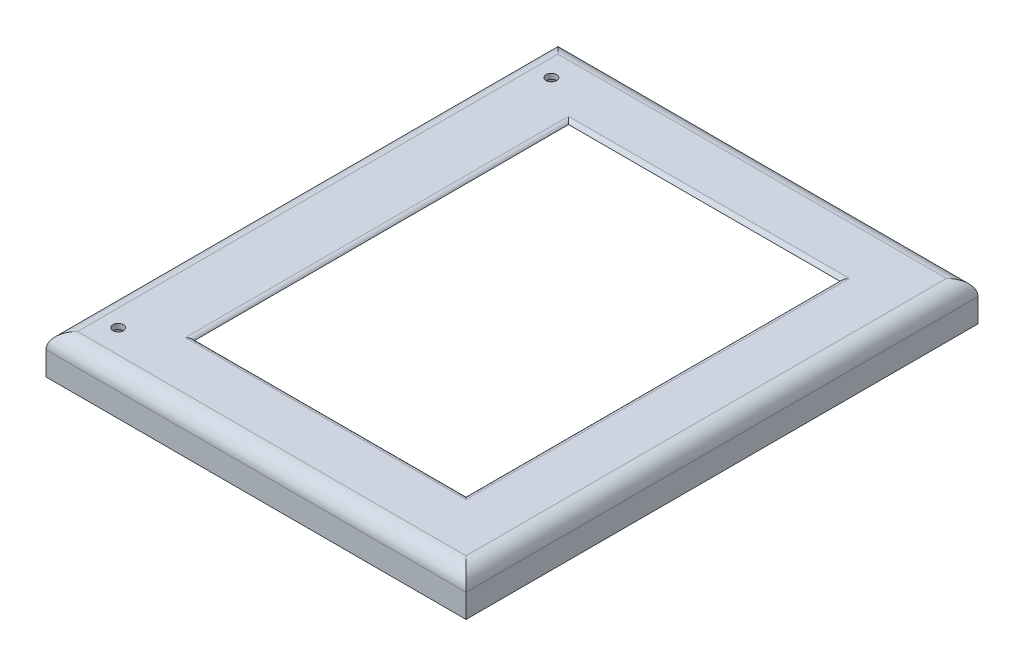
ISO-10303-21;
HEADER;
FILE_DESCRIPTION(('STEP AP214'),'2;1');
FILE_NAME('part.step','',(''),(''),'','','');
FILE_SCHEMA(('AUTOMOTIVE_DESIGN { 1 0 10303 214 1 1 1 1 }'));
ENDSEC;
DATA;
#1=APPLICATION_CONTEXT('core data for automotive mechanical design processes');
#2=APPLICATION_PROTOCOL_DEFINITION('international standard','automotive_design',2000,#1);
#3=PRODUCT_CONTEXT('',#1,'mechanical');
#4=PRODUCT('Part','Part','',(#3));
#5=PRODUCT_RELATED_PRODUCT_CATEGORY('part','',(#4));
#6=PRODUCT_DEFINITION_FORMATION('','',#4);
#7=PRODUCT_DEFINITION_CONTEXT('part definition',#1,'design');
#8=PRODUCT_DEFINITION('design','',#6,#7);
#9=PRODUCT_DEFINITION_SHAPE('','',#8);
#10=(LENGTH_UNIT() NAMED_UNIT(*) SI_UNIT(.MILLI.,.METRE.));
#11=(NAMED_UNIT(*) PLANE_ANGLE_UNIT() SI_UNIT($,.RADIAN.));
#12=(NAMED_UNIT(*) SI_UNIT($,.STERADIAN.) SOLID_ANGLE_UNIT());
#13=UNCERTAINTY_MEASURE_WITH_UNIT(LENGTH_MEASURE(1.E-05),#10,'distance_accuracy_value','');
#14=(GEOMETRIC_REPRESENTATION_CONTEXT(3) GLOBAL_UNCERTAINTY_ASSIGNED_CONTEXT((#13)) GLOBAL_UNIT_ASSIGNED_CONTEXT((#10,
#11,#12)) REPRESENTATION_CONTEXT('',''));
#15=CARTESIAN_POINT('',(0.,0.,0.));
#16=DIRECTION('',(0.,0.,1.));
#17=DIRECTION('',(1.,0.,0.));
#18=AXIS2_PLACEMENT_3D('',#15,#16,#17);
#19=CARTESIAN_POINT('',(70.485,16.51,-90.17));
#20=DIRECTION('',(0.,0.,1.));
#21=DIRECTION('',(1.,0.,0.));
#22=AXIS2_PLACEMENT_3D('',#19,#20,#21);
#23=CYLINDRICAL_SURFACE('',#22,2.54);
#24=CARTESIAN_POINT('',(70.485,16.51,-92.71));
#25=DIRECTION('',(0.707106781186547,0.,0.707106781186547));
#26=DIRECTION('',(-0.707106781186547,0.,0.707106781186548));
#27=AXIS2_PLACEMENT_3D('',#24,#25,#26);
#28=ELLIPSE('',#27,3.59210244842766,2.54);
#29=CARTESIAN_POINT('',(68.2852954743876,17.78,-90.5102954743875));
#30=VERTEX_POINT('',#29);
#31=CARTESIAN_POINT('',(70.485,19.05,-92.71));
#32=VERTEX_POINT('',#31);
#33=EDGE_CURVE('E297',#30,#32,#28,.F.);
#34=ORIENTED_EDGE('',*,*,#33,.F.);
#35=DIRECTION('',(0.,0.,1.));
#36=VECTOR('',#35,1.);
#37=CARTESIAN_POINT('',(68.2852954743876,17.78,-90.17));
#38=LINE('',#37,#36);
#39=CARTESIAN_POINT('',(68.2852954743876,17.78,90.5102954743875));
#40=VERTEX_POINT('',#39);
#41=EDGE_CURVE('E233',#30,#40,#38,.T.);
#42=ORIENTED_EDGE('',*,*,#41,.T.);
#43=CARTESIAN_POINT('',(70.485,16.51,92.71));
#44=DIRECTION('',(-0.707106781186547,0.,0.707106781186548));
#45=DIRECTION('',(-0.707106781186547,0.,-0.707106781186547));
#46=AXIS2_PLACEMENT_3D('',#43,#44,#45);
#47=ELLIPSE('',#46,3.59210244842766,2.54);
#48=CARTESIAN_POINT('',(70.485,19.05,92.71));
#49=VERTEX_POINT('',#48);
#50=EDGE_CURVE('E386',#49,#40,#47,.T.);
#51=ORIENTED_EDGE('',*,*,#50,.F.);
#52=DIRECTION('',(0.,0.,-1.));
#53=VECTOR('',#52,1.);
#54=CARTESIAN_POINT('',(70.485,19.05,90.17));
#55=LINE('',#54,#53);
#56=EDGE_CURVE('E373',#32,#49,#55,.F.);
#57=ORIENTED_EDGE('',*,*,#56,.F.);
#58=EDGE_LOOP('',(#34,#42,#51,#57));
#59=FACE_BOUND('',#58,.T.);
#60=ADVANCED_FACE('F38',(#59),#23,.T.);
#61=CARTESIAN_POINT('',(-62.8,16.51,-92.71));
#62=DIRECTION('',(1.,0.,0.));
#63=DIRECTION('',(0.,0.,-1.));
#64=AXIS2_PLACEMENT_3D('',#61,#62,#63);
#65=CYLINDRICAL_SURFACE('',#64,2.54);
#66=CARTESIAN_POINT('',(-65.34,16.51,-92.71));
#67=DIRECTION('',(0.707106781186547,0.,-0.707106781186548));
#68=DIRECTION('',(-0.707106781186548,0.,-0.707106781186547));
#69=AXIS2_PLACEMENT_3D('',#66,#67,#68);
#70=ELLIPSE('',#69,3.59210244842766,2.54);
#71=CARTESIAN_POINT('',(-63.1402954743875,17.78,-90.5102954743875));
#72=VERTEX_POINT('',#71);
#73=CARTESIAN_POINT('',(-65.34,19.05,-92.71));
#74=VERTEX_POINT('',#73);
#75=EDGE_CURVE('E384',#72,#74,#70,.F.);
#76=ORIENTED_EDGE('',*,*,#75,.F.);
#77=DIRECTION('',(1.,0.,0.));
#78=VECTOR('',#77,1.);
#79=CARTESIAN_POINT('',(-62.8,17.78,-90.5102954743875));
#80=LINE('',#79,#78);
#81=EDGE_CURVE('E61',#72,#30,#80,.T.);
#82=ORIENTED_EDGE('',*,*,#81,.T.);
#83=ORIENTED_EDGE('',*,*,#33,.T.);
#84=DIRECTION('',(-1.,0.,0.));
#85=VECTOR('',#84,1.);
#86=CARTESIAN_POINT('',(67.945,19.05,-92.71));
#87=LINE('',#86,#85);
#88=EDGE_CURVE('E360',#74,#32,#87,.F.);
#89=ORIENTED_EDGE('',*,*,#88,.F.);
#90=EDGE_LOOP('',(#76,#82,#83,#89));
#91=FACE_BOUND('',#90,.T.);
#92=ADVANCED_FACE('F392',(#91),#65,.T.);
#93=CARTESIAN_POINT('',(-62.8,16.51,92.71));
#94=DIRECTION('',(-1.,0.,0.));
#95=DIRECTION('',(0.,0.,1.));
#96=AXIS2_PLACEMENT_3D('',#93,#94,#95);
#97=CYLINDRICAL_SURFACE('',#96,2.54);
#98=ORIENTED_EDGE('',*,*,#50,.T.);
#99=DIRECTION('',(-1.,0.,0.));
#100=VECTOR('',#99,1.);
#101=CARTESIAN_POINT('',(-62.8,17.78,90.5102954743875));
#102=LINE('',#101,#100);
#103=CARTESIAN_POINT('',(-63.1402954743875,17.78,90.5102954743875));
#104=VERTEX_POINT('',#103);
#105=EDGE_CURVE('E223',#40,#104,#102,.T.);
#106=ORIENTED_EDGE('',*,*,#105,.T.);
#107=CARTESIAN_POINT('',(-65.34,16.51,92.71));
#108=DIRECTION('',(-0.707106781186548,0.,-0.707106781186547));
#109=DIRECTION('',(0.707106781186547,0.,-0.707106781186548));
#110=AXIS2_PLACEMENT_3D('',#107,#108,#109);
#111=ELLIPSE('',#110,3.59210244842766,2.54);
#112=CARTESIAN_POINT('',(-65.34,19.05,92.71));
#113=VERTEX_POINT('',#112);
#114=EDGE_CURVE('E248',#113,#104,#111,.T.);
#115=ORIENTED_EDGE('',*,*,#114,.F.);
#116=DIRECTION('',(1.,0.,0.));
#117=VECTOR('',#116,1.);
#118=CARTESIAN_POINT('',(-62.8,19.05,92.71));
#119=LINE('',#118,#117);
#120=EDGE_CURVE('E375',#49,#113,#119,.F.);
#121=ORIENTED_EDGE('',*,*,#120,.F.);
#122=EDGE_LOOP('',(#98,#106,#115,#121));
#123=FACE_BOUND('',#122,.T.);
#124=ADVANCED_FACE('F403',(#123),#97,.T.);
#125=CARTESIAN_POINT('',(-65.34,16.51,-90.17));
#126=DIRECTION('',(0.,0.,-1.));
#127=DIRECTION('',(-1.,0.,0.));
#128=AXIS2_PLACEMENT_3D('',#125,#126,#127);
#129=CYLINDRICAL_SURFACE('',#128,2.54);
#130=ORIENTED_EDGE('',*,*,#114,.T.);
#131=DIRECTION('',(0.,0.,-1.));
#132=VECTOR('',#131,1.);
#133=CARTESIAN_POINT('',(-63.1402954743875,17.78,-90.17));
#134=LINE('',#133,#132);
#135=EDGE_CURVE('E11',#104,#72,#134,.T.);
#136=ORIENTED_EDGE('',*,*,#135,.T.);
#137=ORIENTED_EDGE('',*,*,#75,.T.);
#138=DIRECTION('',(0.,0.,1.));
#139=VECTOR('',#138,1.);
#140=CARTESIAN_POINT('',(-65.34,19.05,-90.17));
#141=LINE('',#140,#139);
#142=EDGE_CURVE('E46',#113,#74,#141,.F.);
#143=ORIENTED_EDGE('',*,*,#142,.F.);
#144=EDGE_LOOP('',(#130,#136,#137,#143));
#145=FACE_BOUND('',#144,.T.);
#146=ADVANCED_FACE('F405',(#145),#129,.T.);
#147=CARTESIAN_POINT('',(101.6,19.05,-123.825));
#148=DIRECTION('',(-1.,0.,0.));
#149=DIRECTION('',(0.,0.,1.));
#150=AXIS2_PLACEMENT_3D('',#147,#148,#149);
#151=PLANE('',#150);
#152=DIRECTION('',(0.,-1.,0.));
#153=VECTOR('',#152,1.);
#154=CARTESIAN_POINT('',(101.6,19.05,-123.825));
#155=LINE('',#154,#153);
#156=CARTESIAN_POINT('',(101.6,11.43,-123.825));
#157=VERTEX_POINT('',#156);
#158=CARTESIAN_POINT('',(101.6,0.,-123.825));
#159=VERTEX_POINT('',#158);
#160=EDGE_CURVE('E334',#157,#159,#155,.T.);
#161=ORIENTED_EDGE('',*,*,#160,.F.);
#162=DIRECTION('',(0.,0.,-1.));
#163=VECTOR('',#162,1.);
#164=CARTESIAN_POINT('',(101.6,11.43,123.825));
#165=LINE('',#164,#163);
#166=CARTESIAN_POINT('',(101.6,11.43,123.825));
#167=VERTEX_POINT('',#166);
#168=EDGE_CURVE('E358',#157,#167,#165,.F.);
#169=ORIENTED_EDGE('',*,*,#168,.T.);
#170=DIRECTION('',(0.,-1.,0.));
#171=VECTOR('',#170,1.);
#172=CARTESIAN_POINT('',(101.6,19.05,123.825));
#173=LINE('',#172,#171);
#174=CARTESIAN_POINT('',(101.6,0.,123.825));
#175=VERTEX_POINT('',#174);
#176=EDGE_CURVE('E327',#167,#175,#173,.T.);
#177=ORIENTED_EDGE('',*,*,#176,.T.);
#178=DIRECTION('',(0.,0.,-1.));
#179=VECTOR('',#178,1.);
#180=CARTESIAN_POINT('',(101.6,0.,-123.825));
#181=LINE('',#180,#179);
#182=EDGE_CURVE('E311',#175,#159,#181,.T.);
#183=ORIENTED_EDGE('',*,*,#182,.T.);
#184=EDGE_LOOP('',(#161,#169,#177,#183));
#185=FACE_BOUND('',#184,.T.);
#186=ADVANCED_FACE('F425',(#185),#151,.F.);
#187=CARTESIAN_POINT('',(-101.6,19.05,-123.825));
#188=DIRECTION('',(0.,0.,1.));
#189=DIRECTION('',(1.,0.,0.));
#190=AXIS2_PLACEMENT_3D('',#187,#188,#189);
#191=PLANE('',#190);
#192=DIRECTION('',(0.,-1.,0.));
#193=VECTOR('',#192,1.);
#194=CARTESIAN_POINT('',(-101.6,19.05,-123.825));
#195=LINE('',#194,#193);
#196=CARTESIAN_POINT('',(-101.6,11.43,-123.825));
#197=VERTEX_POINT('',#196);
#198=CARTESIAN_POINT('',(-101.6,0.,-123.825));
#199=VERTEX_POINT('',#198);
#200=EDGE_CURVE('E332',#197,#199,#195,.T.);
#201=ORIENTED_EDGE('',*,*,#200,.F.);
#202=DIRECTION('',(-1.,0.,0.));
#203=VECTOR('',#202,1.);
#204=CARTESIAN_POINT('',(101.6,11.43,-123.825));
#205=LINE('',#204,#203);
#206=EDGE_CURVE('E355',#197,#157,#205,.F.);
#207=ORIENTED_EDGE('',*,*,#206,.T.);
#208=ORIENTED_EDGE('',*,*,#160,.T.);
#209=DIRECTION('',(-1.,0.,0.));
#210=VECTOR('',#209,1.);
#211=CARTESIAN_POINT('',(-101.6,0.,-123.825));
#212=LINE('',#211,#210);
#213=EDGE_CURVE('E314',#159,#199,#212,.T.);
#214=ORIENTED_EDGE('',*,*,#213,.T.);
#215=EDGE_LOOP('',(#201,#207,#208,#214));
#216=FACE_BOUND('',#215,.T.);
#217=ADVANCED_FACE('F446',(#216),#191,.F.);
#218=CARTESIAN_POINT('',(-101.6,19.05,-123.825));
#219=DIRECTION('',(1.,0.,0.));
#220=DIRECTION('',(0.,0.,-1.));
#221=AXIS2_PLACEMENT_3D('',#218,#219,#220);
#222=PLANE('',#221);
#223=DIRECTION('',(0.,-1.,0.));
#224=VECTOR('',#223,1.);
#225=CARTESIAN_POINT('',(-101.6,19.05,123.825));
#226=LINE('',#225,#224);
#227=CARTESIAN_POINT('',(-101.6,11.43,123.825));
#228=VERTEX_POINT('',#227);
#229=CARTESIAN_POINT('',(-101.6,0.,123.825));
#230=VERTEX_POINT('',#229);
#231=EDGE_CURVE('E329',#228,#230,#226,.T.);
#232=ORIENTED_EDGE('',*,*,#231,.F.);
#233=DIRECTION('',(0.,0.,1.));
#234=VECTOR('',#233,1.);
#235=CARTESIAN_POINT('',(-101.6,11.43,-123.825));
#236=LINE('',#235,#234);
#237=EDGE_CURVE('E352',#228,#197,#236,.F.);
#238=ORIENTED_EDGE('',*,*,#237,.T.);
#239=ORIENTED_EDGE('',*,*,#200,.T.);
#240=DIRECTION('',(0.,0.,1.));
#241=VECTOR('',#240,1.);
#242=CARTESIAN_POINT('',(-101.6,0.,-123.825));
#243=LINE('',#242,#241);
#244=EDGE_CURVE('E319',#199,#230,#243,.T.);
#245=ORIENTED_EDGE('',*,*,#244,.T.);
#246=EDGE_LOOP('',(#232,#238,#239,#245));
#247=FACE_BOUND('',#246,.T.);
#248=ADVANCED_FACE('F450',(#247),#222,.F.);
#249=CARTESIAN_POINT('',(-101.6,19.05,123.825));
#250=DIRECTION('',(0.,0.,-1.));
#251=DIRECTION('',(-1.,0.,0.));
#252=AXIS2_PLACEMENT_3D('',#249,#250,#251);
#253=PLANE('',#252);
#254=ORIENTED_EDGE('',*,*,#176,.F.);
#255=DIRECTION('',(1.,0.,0.));
#256=VECTOR('',#255,1.);
#257=CARTESIAN_POINT('',(-101.6,11.43,123.825));
#258=LINE('',#257,#256);
#259=EDGE_CURVE('E348',#167,#228,#258,.F.);
#260=ORIENTED_EDGE('',*,*,#259,.T.);
#261=ORIENTED_EDGE('',*,*,#231,.T.);
#262=DIRECTION('',(1.,0.,0.));
#263=VECTOR('',#262,1.);
#264=CARTESIAN_POINT('',(-101.6,0.,123.825));
#265=LINE('',#264,#263);
#266=EDGE_CURVE('E323',#230,#175,#265,.T.);
#267=ORIENTED_EDGE('',*,*,#266,.T.);
#268=EDGE_LOOP('',(#254,#260,#261,#267));
#269=FACE_BOUND('',#268,.T.);
#270=ADVANCED_FACE('F454',(#269),#253,.F.);
#271=CARTESIAN_POINT('',(0.,19.05,0.));
#272=DIRECTION('',(0.,1.,0.));
#273=DIRECTION('',(0.,0.,1.));
#274=AXIS2_PLACEMENT_3D('',#271,#272,#273);
#275=PLANE('',#274);
#276=CARTESIAN_POINT('',(-85.7249999999999,19.05,104.775));
#277=DIRECTION('',(0.,1.,0.));
#278=DIRECTION('',(0.,0.,1.));
#279=AXIS2_PLACEMENT_3D('',#276,#277,#278);
#280=CIRCLE('',#279,2.53999999999999);
#281=CARTESIAN_POINT('',(-85.7249999999999,19.05,107.315));
#282=VERTEX_POINT('',#281);
#283=EDGE_CURVE('E236',#282,#282,#280,.T.);
#284=ORIENTED_EDGE('',*,*,#283,.F.);
#285=EDGE_LOOP('',(#284));
#286=FACE_BOUND('',#285,.T.);
#287=CARTESIAN_POINT('',(-85.7249999999999,19.05,-104.775));
#288=DIRECTION('',(0.,1.,0.));
#289=DIRECTION('',(0.,0.,1.));
#290=AXIS2_PLACEMENT_3D('',#287,#288,#289);
#291=CIRCLE('',#290,2.53999999999999);
#292=CARTESIAN_POINT('',(-85.7249999999999,19.05,-102.235));
#293=VERTEX_POINT('',#292);
#294=EDGE_CURVE('E242',#293,#293,#291,.T.);
#295=ORIENTED_EDGE('',*,*,#294,.F.);
#296=EDGE_LOOP('',(#295));
#297=FACE_BOUND('',#296,.T.);
#298=ORIENTED_EDGE('',*,*,#120,.T.);
#299=ORIENTED_EDGE('',*,*,#142,.T.);
#300=ORIENTED_EDGE('',*,*,#88,.T.);
#301=ORIENTED_EDGE('',*,*,#56,.T.);
#302=EDGE_LOOP('',(#298,#299,#300,#301));
#303=FACE_BOUND('',#302,.T.);
#304=DIRECTION('',(0.,0.,1.));
#305=VECTOR('',#304,1.);
#306=CARTESIAN_POINT('',(-93.9799999999999,19.05,123.825));
#307=LINE('',#306,#305);
#308=CARTESIAN_POINT('',(-93.98,19.05,-116.205));
#309=VERTEX_POINT('',#308);
#310=CARTESIAN_POINT('',(-93.9799999999999,19.05,116.205));
#311=VERTEX_POINT('',#310);
#312=EDGE_CURVE('E341',#309,#311,#307,.T.);
#313=ORIENTED_EDGE('',*,*,#312,.T.);
#314=DIRECTION('',(1.,0.,0.));
#315=VECTOR('',#314,1.);
#316=CARTESIAN_POINT('',(101.6,19.05,116.205));
#317=LINE('',#316,#315);
#318=CARTESIAN_POINT('',(93.98,19.05,116.205));
#319=VERTEX_POINT('',#318);
#320=EDGE_CURVE('E344',#311,#319,#317,.T.);
#321=ORIENTED_EDGE('',*,*,#320,.T.);
#322=DIRECTION('',(0.,0.,-1.));
#323=VECTOR('',#322,1.);
#324=CARTESIAN_POINT('',(93.98,19.05,-123.825));
#325=LINE('',#324,#323);
#326=CARTESIAN_POINT('',(93.98,19.05,-116.205));
#327=VERTEX_POINT('',#326);
#328=EDGE_CURVE('E336',#319,#327,#325,.T.);
#329=ORIENTED_EDGE('',*,*,#328,.T.);
#330=DIRECTION('',(-1.,0.,0.));
#331=VECTOR('',#330,1.);
#332=CARTESIAN_POINT('',(-101.6,19.05,-116.205));
#333=LINE('',#332,#331);
#334=EDGE_CURVE('E338',#327,#309,#333,.T.);
#335=ORIENTED_EDGE('',*,*,#334,.T.);
#336=EDGE_LOOP('',(#313,#321,#329,#335));
#337=FACE_BOUND('',#336,.T.);
#338=ADVANCED_FACE('F396',(#286,#297,#303,#337),#275,.T.);
#339=CARTESIAN_POINT('',(0.,0.,0.));
#340=DIRECTION('',(0.,1.,0.));
#341=DIRECTION('',(0.,0.,1.));
#342=AXIS2_PLACEMENT_3D('',#339,#340,#341);
#343=PLANE('',#342);
#344=DIRECTION('',(1.,0.,0.));
#345=VECTOR('',#344,1.);
#346=CARTESIAN_POINT('',(-101.6,0.,121.285));
#347=LINE('',#346,#345);
#348=CARTESIAN_POINT('',(-99.06,0.,121.285));
#349=VERTEX_POINT('',#348);
#350=CARTESIAN_POINT('',(99.06,0.,121.285));
#351=VERTEX_POINT('',#350);
#352=EDGE_CURVE('E260',#349,#351,#347,.T.);
#353=ORIENTED_EDGE('',*,*,#352,.T.);
#354=DIRECTION('',(0.,0.,-1.));
#355=VECTOR('',#354,1.);
#356=CARTESIAN_POINT('',(99.06,0.,-123.825));
#357=LINE('',#356,#355);
#358=CARTESIAN_POINT('',(99.06,0.,-121.285));
#359=VERTEX_POINT('',#358);
#360=EDGE_CURVE('E278',#351,#359,#357,.T.);
#361=ORIENTED_EDGE('',*,*,#360,.T.);
#362=DIRECTION('',(-1.,0.,0.));
#363=VECTOR('',#362,1.);
#364=CARTESIAN_POINT('',(-101.6,0.,-121.285));
#365=LINE('',#364,#363);
#366=CARTESIAN_POINT('',(-99.06,0.,-121.285));
#367=VERTEX_POINT('',#366);
#368=EDGE_CURVE('E300',#359,#367,#365,.T.);
#369=ORIENTED_EDGE('',*,*,#368,.T.);
#370=DIRECTION('',(0.,0.,1.));
#371=VECTOR('',#370,1.);
#372=CARTESIAN_POINT('',(-99.06,0.,-123.825));
#373=LINE('',#372,#371);
#374=EDGE_CURVE('E304',#367,#349,#373,.T.);
#375=ORIENTED_EDGE('',*,*,#374,.T.);
#376=EDGE_LOOP('',(#353,#361,#369,#375));
#377=FACE_BOUND('',#376,.T.);
#378=ORIENTED_EDGE('',*,*,#182,.F.);
#379=ORIENTED_EDGE('',*,*,#266,.F.);
#380=ORIENTED_EDGE('',*,*,#244,.F.);
#381=ORIENTED_EDGE('',*,*,#213,.F.);
#382=EDGE_LOOP('',(#378,#379,#380,#381));
#383=FACE_BOUND('',#382,.T.);
#384=ADVANCED_FACE('F430',(#377,#383),#343,.F.);
#385=CARTESIAN_POINT('',(0.,11.43,-116.205));
#386=DIRECTION('',(1.,0.,0.));
#387=DIRECTION('',(0.,0.,-1.));
#388=AXIS2_PLACEMENT_3D('',#385,#386,#387);
#389=CYLINDRICAL_SURFACE('',#388,7.62);
#390=CARTESIAN_POINT('',(93.98,11.43,-116.205));
#391=DIRECTION('',(0.707106781186548,0.,0.707106781186547));
#392=DIRECTION('',(-0.707106781186547,0.,0.707106781186548));
#393=AXIS2_PLACEMENT_3D('',#390,#391,#392);
#394=ELLIPSE('',#393,10.776307345283,7.62);
#395=EDGE_CURVE('E365',#157,#327,#394,.T.);
#396=ORIENTED_EDGE('',*,*,#395,.F.);
#397=ORIENTED_EDGE('',*,*,#206,.F.);
#398=CARTESIAN_POINT('',(-93.98,11.43,-116.205));
#399=DIRECTION('',(0.707106781186547,0.,-0.707106781186548));
#400=DIRECTION('',(0.707106781186548,0.,0.707106781186547));
#401=AXIS2_PLACEMENT_3D('',#398,#399,#400);
#402=ELLIPSE('',#401,10.776307345283,7.62);
#403=EDGE_CURVE('E315',#309,#197,#402,.F.);
#404=ORIENTED_EDGE('',*,*,#403,.F.);
#405=ORIENTED_EDGE('',*,*,#334,.F.);
#406=EDGE_LOOP('',(#396,#397,#404,#405));
#407=FACE_BOUND('',#406,.T.);
#408=ADVANCED_FACE('F426',(#407),#389,.T.);
#409=CARTESIAN_POINT('',(-93.98,11.43,0.));
#410=DIRECTION('',(0.,0.,-1.));
#411=DIRECTION('',(-1.,0.,0.));
#412=AXIS2_PLACEMENT_3D('',#409,#410,#411);
#413=CYLINDRICAL_SURFACE('',#412,7.62);
#414=ORIENTED_EDGE('',*,*,#403,.T.);
#415=ORIENTED_EDGE('',*,*,#237,.F.);
#416=CARTESIAN_POINT('',(-93.9799999999999,11.43,116.205));
#417=DIRECTION('',(-0.707106781186548,0.,-0.707106781186547));
#418=DIRECTION('',(0.707106781186547,0.,-0.707106781186548));
#419=AXIS2_PLACEMENT_3D('',#416,#417,#418);
#420=ELLIPSE('',#419,10.776307345283,7.62);
#421=EDGE_CURVE('E362',#311,#228,#420,.F.);
#422=ORIENTED_EDGE('',*,*,#421,.F.);
#423=ORIENTED_EDGE('',*,*,#312,.F.);
#424=EDGE_LOOP('',(#414,#415,#422,#423));
#425=FACE_BOUND('',#424,.T.);
#426=ADVANCED_FACE('F429',(#425),#413,.T.);
#427=CARTESIAN_POINT('',(93.98,11.43,0.));
#428=DIRECTION('',(0.,0.,1.));
#429=DIRECTION('',(1.,0.,0.));
#430=AXIS2_PLACEMENT_3D('',#427,#428,#429);
#431=CYLINDRICAL_SURFACE('',#430,7.62);
#432=ORIENTED_EDGE('',*,*,#395,.T.);
#433=ORIENTED_EDGE('',*,*,#328,.F.);
#434=CARTESIAN_POINT('',(93.98,11.43,116.205));
#435=DIRECTION('',(-0.707106781186547,0.,0.707106781186548));
#436=DIRECTION('',(0.707106781186548,0.,0.707106781186547));
#437=AXIS2_PLACEMENT_3D('',#434,#435,#436);
#438=ELLIPSE('',#437,10.776307345283,7.62);
#439=EDGE_CURVE('E255',#167,#319,#438,.T.);
#440=ORIENTED_EDGE('',*,*,#439,.F.);
#441=ORIENTED_EDGE('',*,*,#168,.F.);
#442=EDGE_LOOP('',(#432,#433,#440,#441));
#443=FACE_BOUND('',#442,.T.);
#444=ADVANCED_FACE('F434',(#443),#431,.T.);
#445=CARTESIAN_POINT('',(0.,11.43,116.205));
#446=DIRECTION('',(-1.,0.,0.));
#447=DIRECTION('',(0.,0.,1.));
#448=AXIS2_PLACEMENT_3D('',#445,#446,#447);
#449=CYLINDRICAL_SURFACE('',#448,7.62);
#450=ORIENTED_EDGE('',*,*,#421,.T.);
#451=ORIENTED_EDGE('',*,*,#259,.F.);
#452=ORIENTED_EDGE('',*,*,#439,.T.);
#453=ORIENTED_EDGE('',*,*,#320,.F.);
#454=EDGE_LOOP('',(#450,#451,#452,#453));
#455=FACE_BOUND('',#454,.T.);
#456=ADVANCED_FACE('F438',(#455),#449,.T.);
#457=CARTESIAN_POINT('',(99.06,19.05,-123.825));
#458=DIRECTION('',(-1.,0.,0.));
#459=DIRECTION('',(0.,0.,1.));
#460=AXIS2_PLACEMENT_3D('',#457,#458,#459);
#461=PLANE('',#460);
#462=DIRECTION('',(0.,-1.,0.));
#463=VECTOR('',#462,1.);
#464=CARTESIAN_POINT('',(99.06,19.05,-121.285));
#465=LINE('',#464,#463);
#466=CARTESIAN_POINT('',(99.06,11.43,-121.285));
#467=VERTEX_POINT('',#466);
#468=EDGE_CURVE('E249',#467,#359,#465,.T.);
#469=ORIENTED_EDGE('',*,*,#468,.T.);
#470=ORIENTED_EDGE('',*,*,#360,.F.);
#471=DIRECTION('',(0.,-1.,0.));
#472=VECTOR('',#471,1.);
#473=CARTESIAN_POINT('',(99.06,19.05,121.285));
#474=LINE('',#473,#472);
#475=CARTESIAN_POINT('',(99.06,11.43,121.285));
#476=VERTEX_POINT('',#475);
#477=EDGE_CURVE('E257',#476,#351,#474,.T.);
#478=ORIENTED_EDGE('',*,*,#477,.F.);
#479=DIRECTION('',(0.,0.,1.));
#480=VECTOR('',#479,1.);
#481=CARTESIAN_POINT('',(99.06,11.43,-123.825));
#482=LINE('',#481,#480);
#483=EDGE_CURVE('E253',#467,#476,#482,.T.);
#484=ORIENTED_EDGE('',*,*,#483,.F.);
#485=EDGE_LOOP('',(#469,#470,#478,#484));
#486=FACE_BOUND('',#485,.T.);
#487=ADVANCED_FACE('F442',(#486),#461,.T.);
#488=CARTESIAN_POINT('',(-101.6,19.05,-121.285));
#489=DIRECTION('',(0.,0.,1.));
#490=DIRECTION('',(1.,0.,0.));
#491=AXIS2_PLACEMENT_3D('',#488,#489,#490);
#492=PLANE('',#491);
#493=DIRECTION('',(0.,-1.,0.));
#494=VECTOR('',#493,1.);
#495=CARTESIAN_POINT('',(-99.06,19.05,-121.285));
#496=LINE('',#495,#494);
#497=CARTESIAN_POINT('',(-99.06,11.43,-121.285));
#498=VERTEX_POINT('',#497);
#499=EDGE_CURVE('E252',#498,#367,#496,.T.);
#500=ORIENTED_EDGE('',*,*,#499,.T.);
#501=ORIENTED_EDGE('',*,*,#368,.F.);
#502=ORIENTED_EDGE('',*,*,#468,.F.);
#503=DIRECTION('',(1.,0.,0.));
#504=VECTOR('',#503,1.);
#505=CARTESIAN_POINT('',(-101.6,11.43,-121.285));
#506=LINE('',#505,#504);
#507=EDGE_CURVE('E256',#498,#467,#506,.T.);
#508=ORIENTED_EDGE('',*,*,#507,.F.);
#509=EDGE_LOOP('',(#500,#501,#502,#508));
#510=FACE_BOUND('',#509,.T.);
#511=ADVANCED_FACE('F493',(#510),#492,.T.);
#512=CARTESIAN_POINT('',(-99.06,19.05,-123.825));
#513=DIRECTION('',(1.,0.,0.));
#514=DIRECTION('',(0.,0.,-1.));
#515=AXIS2_PLACEMENT_3D('',#512,#513,#514);
#516=PLANE('',#515);
#517=DIRECTION('',(0.,-1.,0.));
#518=VECTOR('',#517,1.);
#519=CARTESIAN_POINT('',(-99.06,19.05,121.285));
#520=LINE('',#519,#518);
#521=CARTESIAN_POINT('',(-99.06,11.43,121.285));
#522=VERTEX_POINT('',#521);
#523=EDGE_CURVE('E259',#522,#349,#520,.T.);
#524=ORIENTED_EDGE('',*,*,#523,.T.);
#525=ORIENTED_EDGE('',*,*,#374,.F.);
#526=ORIENTED_EDGE('',*,*,#499,.F.);
#527=DIRECTION('',(0.,0.,-1.));
#528=VECTOR('',#527,1.);
#529=CARTESIAN_POINT('',(-99.06,11.43,-123.825));
#530=LINE('',#529,#528);
#531=EDGE_CURVE('E265',#522,#498,#530,.T.);
#532=ORIENTED_EDGE('',*,*,#531,.F.);
#533=EDGE_LOOP('',(#524,#525,#526,#532));
#534=FACE_BOUND('',#533,.T.);
#535=ADVANCED_FACE('F489',(#534),#516,.T.);
#536=CARTESIAN_POINT('',(-101.6,19.05,121.285));
#537=DIRECTION('',(0.,0.,-1.));
#538=DIRECTION('',(-1.,0.,0.));
#539=AXIS2_PLACEMENT_3D('',#536,#537,#538);
#540=PLANE('',#539);
#541=ORIENTED_EDGE('',*,*,#477,.T.);
#542=ORIENTED_EDGE('',*,*,#352,.F.);
#543=ORIENTED_EDGE('',*,*,#523,.F.);
#544=DIRECTION('',(-1.,0.,0.));
#545=VECTOR('',#544,1.);
#546=CARTESIAN_POINT('',(-101.6,11.43,121.285));
#547=LINE('',#546,#545);
#548=EDGE_CURVE('E270',#476,#522,#547,.T.);
#549=ORIENTED_EDGE('',*,*,#548,.F.);
#550=EDGE_LOOP('',(#541,#542,#543,#549));
#551=FACE_BOUND('',#550,.T.);
#552=ADVANCED_FACE('F485',(#551),#540,.T.);
#553=CARTESIAN_POINT('',(0.,16.51,0.));
#554=DIRECTION('',(0.,1.,0.));
#555=DIRECTION('',(0.,0.,1.));
#556=AXIS2_PLACEMENT_3D('',#553,#554,#555);
#557=PLANE('',#556);
#558=DIRECTION('',(-1.,0.,0.));
#559=VECTOR('',#558,1.);
#560=CARTESIAN_POINT('',(70.485,16.51,92.71));
#561=LINE('',#560,#559);
#562=CARTESIAN_POINT('',(70.485,16.51,92.71));
#563=VERTEX_POINT('',#562);
#564=CARTESIAN_POINT('',(-65.34,16.51,92.7099999999999));
#565=VERTEX_POINT('',#564);
#566=EDGE_CURVE('E215',#563,#565,#561,.T.);
#567=ORIENTED_EDGE('',*,*,#566,.F.);
#568=DIRECTION('',(0.,0.,1.));
#569=VECTOR('',#568,1.);
#570=CARTESIAN_POINT('',(70.485,16.51,-92.71));
#571=LINE('',#570,#569);
#572=CARTESIAN_POINT('',(70.485,16.51,-92.71));
#573=VERTEX_POINT('',#572);
#574=EDGE_CURVE('E53',#573,#563,#571,.T.);
#575=ORIENTED_EDGE('',*,*,#574,.F.);
#576=DIRECTION('',(1.,0.,0.));
#577=VECTOR('',#576,1.);
#578=CARTESIAN_POINT('',(70.485,16.51,-92.71));
#579=LINE('',#578,#577);
#580=CARTESIAN_POINT('',(-65.34,16.51,-92.71));
#581=VERTEX_POINT('',#580);
#582=EDGE_CURVE('E203',#581,#573,#579,.T.);
#583=ORIENTED_EDGE('',*,*,#582,.F.);
#584=DIRECTION('',(0.,0.,-1.));
#585=VECTOR('',#584,1.);
#586=CARTESIAN_POINT('',(-65.34,16.51,-92.71));
#587=LINE('',#586,#585);
#588=EDGE_CURVE('E207',#565,#581,#587,.T.);
#589=ORIENTED_EDGE('',*,*,#588,.F.);
#590=EDGE_LOOP('',(#567,#575,#583,#589));
#591=FACE_BOUND('',#590,.T.);
#592=CARTESIAN_POINT('',(-85.7249999999999,16.51,104.775));
#593=DIRECTION('',(0.,1.,0.));
#594=DIRECTION('',(0.,0.,1.));
#595=AXIS2_PLACEMENT_3D('',#592,#593,#594);
#596=CIRCLE('',#595,2.53999999999999);
#597=CARTESIAN_POINT('',(-85.7249999999999,16.51,107.315));
#598=VERTEX_POINT('',#597);
#599=EDGE_CURVE('E239',#598,#598,#596,.F.);
#600=ORIENTED_EDGE('',*,*,#599,.F.);
#601=EDGE_LOOP('',(#600));
#602=FACE_BOUND('',#601,.T.);
#603=CARTESIAN_POINT('',(-85.7249999999999,16.51,-104.775));
#604=DIRECTION('',(0.,1.,0.));
#605=DIRECTION('',(0.,0.,1.));
#606=AXIS2_PLACEMENT_3D('',#603,#604,#605);
#607=CIRCLE('',#606,2.53999999999999);
#608=CARTESIAN_POINT('',(-85.7249999999999,16.51,-102.235));
#609=VERTEX_POINT('',#608);
#610=EDGE_CURVE('E245',#609,#609,#607,.F.);
#611=ORIENTED_EDGE('',*,*,#610,.F.);
#612=EDGE_LOOP('',(#611));
#613=FACE_BOUND('',#612,.T.);
#614=DIRECTION('',(0.,0.,1.));
#615=VECTOR('',#614,1.);
#616=CARTESIAN_POINT('',(-93.98,16.51,0.));
#617=LINE('',#616,#615);
#618=CARTESIAN_POINT('',(-93.98,16.51,-116.205));
#619=VERTEX_POINT('',#618);
#620=CARTESIAN_POINT('',(-93.9799999999999,16.51,116.205));
#621=VERTEX_POINT('',#620);
#622=EDGE_CURVE('E284',#619,#621,#617,.T.);
#623=ORIENTED_EDGE('',*,*,#622,.F.);
#624=DIRECTION('',(1.,0.,0.));
#625=VECTOR('',#624,1.);
#626=CARTESIAN_POINT('',(0.,16.51,-116.205));
#627=LINE('',#626,#625);
#628=CARTESIAN_POINT('',(93.98,16.51,-116.205));
#629=VERTEX_POINT('',#628);
#630=EDGE_CURVE('E287',#629,#619,#627,.F.);
#631=ORIENTED_EDGE('',*,*,#630,.F.);
#632=DIRECTION('',(0.,0.,1.));
#633=VECTOR('',#632,1.);
#634=CARTESIAN_POINT('',(93.98,16.51,0.));
#635=LINE('',#634,#633);
#636=CARTESIAN_POINT('',(93.98,16.51,116.205));
#637=VERTEX_POINT('',#636);
#638=EDGE_CURVE('E251',#637,#629,#635,.F.);
#639=ORIENTED_EDGE('',*,*,#638,.F.);
#640=DIRECTION('',(1.,0.,0.));
#641=VECTOR('',#640,1.);
#642=CARTESIAN_POINT('',(0.,16.51,116.205));
#643=LINE('',#642,#641);
#644=EDGE_CURVE('E274',#621,#637,#643,.T.);
#645=ORIENTED_EDGE('',*,*,#644,.F.);
#646=EDGE_LOOP('',(#623,#631,#639,#645));
#647=FACE_BOUND('',#646,.T.);
#648=ADVANCED_FACE('F481',(#591,#602,#613,#647),#557,.F.);
#649=CARTESIAN_POINT('',(0.,11.43,-116.205));
#650=DIRECTION('',(1.,0.,0.));
#651=DIRECTION('',(0.,0.,-1.));
#652=AXIS2_PLACEMENT_3D('',#649,#650,#651);
#653=CYLINDRICAL_SURFACE('',#652,5.08);
#654=CARTESIAN_POINT('',(93.98,11.43,-116.205));
#655=DIRECTION('',(0.707106781186548,0.,0.707106781186547));
#656=DIRECTION('',(-0.707106781186547,0.,0.707106781186548));
#657=AXIS2_PLACEMENT_3D('',#654,#655,#656);
#658=ELLIPSE('',#657,7.18420489685532,5.08);
#659=EDGE_CURVE('E279',#467,#629,#658,.T.);
#660=ORIENTED_EDGE('',*,*,#659,.T.);
#661=ORIENTED_EDGE('',*,*,#630,.T.);
#662=CARTESIAN_POINT('',(-93.98,11.43,-116.205));
#663=DIRECTION('',(0.707106781186547,0.,-0.707106781186548));
#664=DIRECTION('',(-0.707106781186548,0.,-0.707106781186547));
#665=AXIS2_PLACEMENT_3D('',#662,#663,#664);
#666=ELLIPSE('',#665,7.18420489685532,5.08);
#667=EDGE_CURVE('E275',#619,#498,#666,.F.);
#668=ORIENTED_EDGE('',*,*,#667,.T.);
#669=ORIENTED_EDGE('',*,*,#507,.T.);
#670=EDGE_LOOP('',(#660,#661,#668,#669));
#671=FACE_BOUND('',#670,.T.);
#672=ADVANCED_FACE('F477',(#671),#653,.F.);
#673=CARTESIAN_POINT('',(-93.98,11.43,0.));
#674=DIRECTION('',(0.,0.,-1.));
#675=DIRECTION('',(-1.,0.,0.));
#676=AXIS2_PLACEMENT_3D('',#673,#674,#675);
#677=CYLINDRICAL_SURFACE('',#676,5.08);
#678=ORIENTED_EDGE('',*,*,#667,.F.);
#679=ORIENTED_EDGE('',*,*,#622,.T.);
#680=CARTESIAN_POINT('',(-93.9799999999999,11.43,116.205));
#681=DIRECTION('',(-0.707106781186548,0.,-0.707106781186547));
#682=DIRECTION('',(-0.707106781186547,0.,0.707106781186548));
#683=AXIS2_PLACEMENT_3D('',#680,#681,#682);
#684=ELLIPSE('',#683,7.18420489685532,5.08);
#685=EDGE_CURVE('E280',#621,#522,#684,.F.);
#686=ORIENTED_EDGE('',*,*,#685,.T.);
#687=ORIENTED_EDGE('',*,*,#531,.T.);
#688=EDGE_LOOP('',(#678,#679,#686,#687));
#689=FACE_BOUND('',#688,.T.);
#690=ADVANCED_FACE('F473',(#689),#677,.F.);
#691=CARTESIAN_POINT('',(93.98,11.43,0.));
#692=DIRECTION('',(0.,0.,1.));
#693=DIRECTION('',(1.,0.,0.));
#694=AXIS2_PLACEMENT_3D('',#691,#692,#693);
#695=CYLINDRICAL_SURFACE('',#694,5.08);
#696=ORIENTED_EDGE('',*,*,#659,.F.);
#697=ORIENTED_EDGE('',*,*,#483,.T.);
#698=CARTESIAN_POINT('',(93.98,11.43,116.205));
#699=DIRECTION('',(-0.707106781186547,0.,0.707106781186548));
#700=DIRECTION('',(-0.707106781186548,0.,-0.707106781186547));
#701=AXIS2_PLACEMENT_3D('',#698,#699,#700);
#702=ELLIPSE('',#701,7.18420489685532,5.08);
#703=EDGE_CURVE('E283',#476,#637,#702,.T.);
#704=ORIENTED_EDGE('',*,*,#703,.T.);
#705=ORIENTED_EDGE('',*,*,#638,.T.);
#706=EDGE_LOOP('',(#696,#697,#704,#705));
#707=FACE_BOUND('',#706,.T.);
#708=ADVANCED_FACE('F469',(#707),#695,.F.);
#709=CARTESIAN_POINT('',(0.,11.43,116.205));
#710=DIRECTION('',(-1.,0.,0.));
#711=DIRECTION('',(0.,0.,1.));
#712=AXIS2_PLACEMENT_3D('',#709,#710,#711);
#713=CYLINDRICAL_SURFACE('',#712,5.08);
#714=ORIENTED_EDGE('',*,*,#685,.F.);
#715=ORIENTED_EDGE('',*,*,#644,.T.);
#716=ORIENTED_EDGE('',*,*,#703,.F.);
#717=ORIENTED_EDGE('',*,*,#548,.T.);
#718=EDGE_LOOP('',(#714,#715,#716,#717));
#719=FACE_BOUND('',#718,.T.);
#720=ADVANCED_FACE('F465',(#719),#713,.F.);
#721=CARTESIAN_POINT('',(-85.7249999999999,-0.001000000000001,-104.775));
#722=DIRECTION('',(0.,1.,0.));
#723=DIRECTION('',(0.,0.,1.));
#724=AXIS2_PLACEMENT_3D('',#721,#722,#723);
#725=CYLINDRICAL_SURFACE('',#724,2.53999999999999);
#726=ORIENTED_EDGE('',*,*,#294,.T.);
#727=EDGE_LOOP('',(#726));
#728=FACE_BOUND('',#727,.T.);
#729=ORIENTED_EDGE('',*,*,#610,.T.);
#730=EDGE_LOOP('',(#729));
#731=FACE_BOUND('',#730,.T.);
#732=ADVANCED_FACE('F468',(#728,#731),#725,.F.);
#733=CARTESIAN_POINT('',(-85.7249999999999,-0.001000000000001,104.775));
#734=DIRECTION('',(0.,1.,0.));
#735=DIRECTION('',(0.,0.,1.));
#736=AXIS2_PLACEMENT_3D('',#733,#734,#735);
#737=CYLINDRICAL_SURFACE('',#736,2.53999999999999);
#738=ORIENTED_EDGE('',*,*,#283,.T.);
#739=EDGE_LOOP('',(#738));
#740=FACE_BOUND('',#739,.T.);
#741=ORIENTED_EDGE('',*,*,#599,.T.);
#742=EDGE_LOOP('',(#741));
#743=FACE_BOUND('',#742,.T.);
#744=ADVANCED_FACE('F503',(#740,#743),#737,.F.);
#745=CARTESIAN_POINT('',(70.485,17.78,-92.71));
#746=DIRECTION('',(1.,0.,0.));
#747=DIRECTION('',(0.,0.,-1.));
#748=AXIS2_PLACEMENT_3D('',#745,#746,#747);
#749=PLANE('',#748);
#750=ORIENTED_EDGE('',*,*,#574,.T.);
#751=DIRECTION('',(0.,-1.,0.));
#752=VECTOR('',#751,1.);
#753=CARTESIAN_POINT('',(70.485,17.78,92.71));
#754=LINE('',#753,#752);
#755=CARTESIAN_POINT('',(70.485,17.78,92.71));
#756=VERTEX_POINT('',#755);
#757=EDGE_CURVE('E180',#756,#563,#754,.T.);
#758=ORIENTED_EDGE('',*,*,#757,.F.);
#759=DIRECTION('',(0.,0.,1.));
#760=VECTOR('',#759,1.);
#761=CARTESIAN_POINT('',(70.485,17.78,-92.71));
#762=LINE('',#761,#760);
#763=CARTESIAN_POINT('',(70.485,17.78,-92.71));
#764=VERTEX_POINT('',#763);
#765=EDGE_CURVE('E184',#764,#756,#762,.T.);
#766=ORIENTED_EDGE('',*,*,#765,.F.);
#767=DIRECTION('',(0.,-1.,0.));
#768=VECTOR('',#767,1.);
#769=CARTESIAN_POINT('',(70.485,17.78,-92.71));
#770=LINE('',#769,#768);
#771=EDGE_CURVE('E221',#764,#573,#770,.T.);
#772=ORIENTED_EDGE('',*,*,#771,.T.);
#773=EDGE_LOOP('',(#750,#758,#766,#772));
#774=FACE_BOUND('',#773,.T.);
#775=ADVANCED_FACE('F182',(#774),#749,.F.);
#776=CARTESIAN_POINT('',(70.485,17.78,-92.71));
#777=DIRECTION('',(0.,0.,-1.));
#778=DIRECTION('',(-1.,0.,0.));
#779=AXIS2_PLACEMENT_3D('',#776,#777,#778);
#780=PLANE('',#779);
#781=ORIENTED_EDGE('',*,*,#582,.T.);
#782=ORIENTED_EDGE('',*,*,#771,.F.);
#783=DIRECTION('',(1.,0.,0.));
#784=VECTOR('',#783,1.);
#785=CARTESIAN_POINT('',(70.485,17.78,-92.71));
#786=LINE('',#785,#784);
#787=CARTESIAN_POINT('',(-65.34,17.78,-92.71));
#788=VERTEX_POINT('',#787);
#789=EDGE_CURVE('E190',#788,#764,#786,.T.);
#790=ORIENTED_EDGE('',*,*,#789,.F.);
#791=DIRECTION('',(0.,-1.,0.));
#792=VECTOR('',#791,1.);
#793=CARTESIAN_POINT('',(-65.34,17.78,-92.71));
#794=LINE('',#793,#792);
#795=EDGE_CURVE('E224',#788,#581,#794,.T.);
#796=ORIENTED_EDGE('',*,*,#795,.T.);
#797=EDGE_LOOP('',(#781,#782,#790,#796));
#798=FACE_BOUND('',#797,.T.);
#799=ADVANCED_FACE('F509',(#798),#780,.F.);
#800=CARTESIAN_POINT('',(-65.34,17.78,-92.71));
#801=DIRECTION('',(-1.,0.,0.));
#802=DIRECTION('',(0.,0.,1.));
#803=AXIS2_PLACEMENT_3D('',#800,#801,#802);
#804=PLANE('',#803);
#805=ORIENTED_EDGE('',*,*,#588,.T.);
#806=ORIENTED_EDGE('',*,*,#795,.F.);
#807=DIRECTION('',(0.,0.,-1.));
#808=VECTOR('',#807,1.);
#809=CARTESIAN_POINT('',(-65.34,17.78,-92.71));
#810=LINE('',#809,#808);
#811=CARTESIAN_POINT('',(-65.34,17.78,92.7099999999999));
#812=VERTEX_POINT('',#811);
#813=EDGE_CURVE('E199',#812,#788,#810,.T.);
#814=ORIENTED_EDGE('',*,*,#813,.F.);
#815=DIRECTION('',(0.,-1.,0.));
#816=VECTOR('',#815,1.);
#817=CARTESIAN_POINT('',(-65.34,17.78,92.7099999999999));
#818=LINE('',#817,#816);
#819=EDGE_CURVE('E189',#812,#565,#818,.T.);
#820=ORIENTED_EDGE('',*,*,#819,.T.);
#821=EDGE_LOOP('',(#805,#806,#814,#820));
#822=FACE_BOUND('',#821,.T.);
#823=ADVANCED_FACE('F411',(#822),#804,.F.);
#824=CARTESIAN_POINT('',(70.485,17.78,92.71));
#825=DIRECTION('',(0.,0.,1.));
#826=DIRECTION('',(1.,0.,0.));
#827=AXIS2_PLACEMENT_3D('',#824,#825,#826);
#828=PLANE('',#827);
#829=ORIENTED_EDGE('',*,*,#566,.T.);
#830=ORIENTED_EDGE('',*,*,#819,.F.);
#831=DIRECTION('',(-1.,0.,0.));
#832=VECTOR('',#831,1.);
#833=CARTESIAN_POINT('',(70.485,17.78,92.71));
#834=LINE('',#833,#832);
#835=EDGE_CURVE('E193',#756,#812,#834,.T.);
#836=ORIENTED_EDGE('',*,*,#835,.F.);
#837=ORIENTED_EDGE('',*,*,#757,.T.);
#838=EDGE_LOOP('',(#829,#830,#836,#837));
#839=FACE_BOUND('',#838,.T.);
#840=ADVANCED_FACE('F194',(#839),#828,.F.);
#841=CARTESIAN_POINT('',(0.,17.78,0.));
#842=DIRECTION('',(0.,-1.,0.));
#843=DIRECTION('',(0.,0.,-1.));
#844=AXIS2_PLACEMENT_3D('',#841,#842,#843);
#845=PLANE('',#844);
#846=ORIENTED_EDGE('',*,*,#81,.F.);
#847=ORIENTED_EDGE('',*,*,#135,.F.);
#848=ORIENTED_EDGE('',*,*,#105,.F.);
#849=ORIENTED_EDGE('',*,*,#41,.F.);
#850=EDGE_LOOP('',(#846,#847,#848,#849));
#851=FACE_BOUND('',#850,.T.);
#852=ORIENTED_EDGE('',*,*,#765,.T.);
#853=ORIENTED_EDGE('',*,*,#835,.T.);
#854=ORIENTED_EDGE('',*,*,#813,.T.);
#855=ORIENTED_EDGE('',*,*,#789,.T.);
#856=EDGE_LOOP('',(#852,#853,#854,#855));
#857=FACE_BOUND('',#856,.T.);
#858=ADVANCED_FACE('F201',(#851,#857),#845,.T.);
#859=CLOSED_SHELL('',(#60,#92,#124,#146,#186,#217,#248,#270,#338,#384,#408,#426,#444,#456,#487,
#511,#535,#552,#648,#672,#690,#708,#720,#732,#744,#775,#799,#823,#840,#858));
#860=MANIFOLD_SOLID_BREP('B2',#859);
#861=ADVANCED_BREP_SHAPE_REPRESENTATION('',(#18,#860),#14);
#862=SHAPE_DEFINITION_REPRESENTATION(#9,#861);
ENDSEC;
END-ISO-10303-21;
